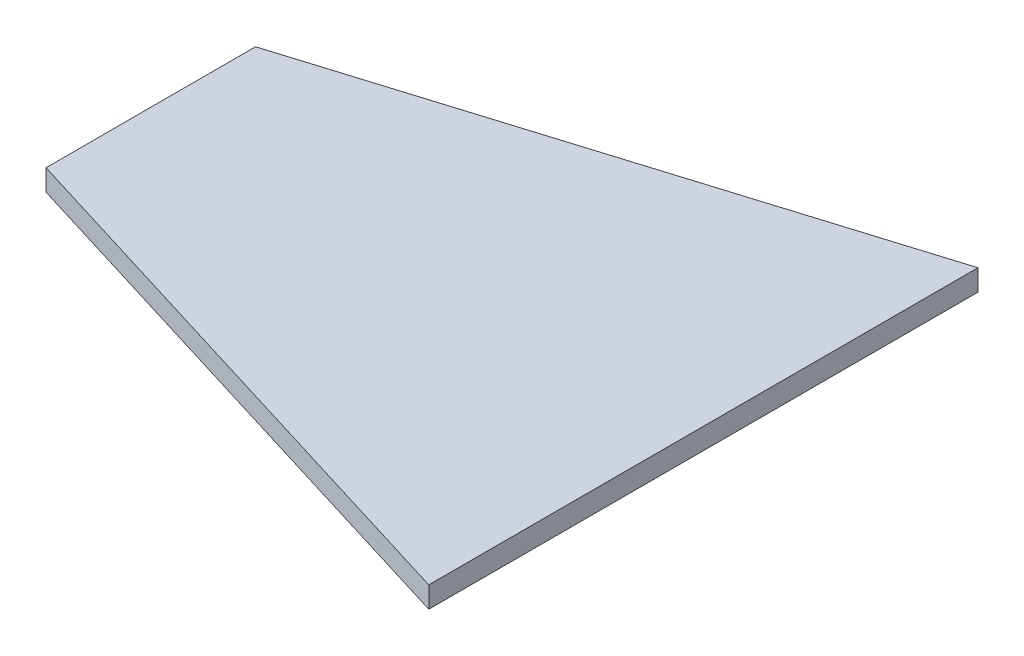
ISO-10303-21;
HEADER;
FILE_DESCRIPTION(('STEP AP214'),'2;1');
FILE_NAME('part.step','',(''),(''),'','','');
FILE_SCHEMA(('AUTOMOTIVE_DESIGN { 1 0 10303 214 1 1 1 1 }'));
ENDSEC;
DATA;
#1=APPLICATION_CONTEXT('core data for automotive mechanical design processes');
#2=APPLICATION_PROTOCOL_DEFINITION('international standard','automotive_design',2000,#1);
#3=PRODUCT_CONTEXT('',#1,'mechanical');
#4=PRODUCT('Part','Part','',(#3));
#5=PRODUCT_RELATED_PRODUCT_CATEGORY('part','',(#4));
#6=PRODUCT_DEFINITION_FORMATION('','',#4);
#7=PRODUCT_DEFINITION_CONTEXT('part definition',#1,'design');
#8=PRODUCT_DEFINITION('design','',#6,#7);
#9=PRODUCT_DEFINITION_SHAPE('','',#8);
#10=(LENGTH_UNIT() NAMED_UNIT(*) SI_UNIT(.MILLI.,.METRE.));
#11=(NAMED_UNIT(*) PLANE_ANGLE_UNIT() SI_UNIT($,.RADIAN.));
#12=(NAMED_UNIT(*) SI_UNIT($,.STERADIAN.) SOLID_ANGLE_UNIT());
#13=UNCERTAINTY_MEASURE_WITH_UNIT(LENGTH_MEASURE(1.E-05),#10,'distance_accuracy_value','');
#14=(GEOMETRIC_REPRESENTATION_CONTEXT(3) GLOBAL_UNCERTAINTY_ASSIGNED_CONTEXT((#13)) GLOBAL_UNIT_ASSIGNED_CONTEXT((#10,
#11,#12)) REPRESENTATION_CONTEXT('',''));
#15=CARTESIAN_POINT('',(0.,0.,0.));
#16=DIRECTION('',(0.,0.,1.));
#17=DIRECTION('',(1.,0.,0.));
#18=AXIS2_PLACEMENT_3D('',#15,#16,#17);
#19=CARTESIAN_POINT('',(-83.058,3.175,-25.527));
#20=DIRECTION('',(0.293777716548138,0.,-0.955873764290956));
#21=DIRECTION('',(-0.955873764290956,0.,-0.293777716548138));
#22=AXIS2_PLACEMENT_3D('',#19,#20,#21);
#23=PLANE('',#22);
#24=DIRECTION('',(0.955873764290956,0.,0.293777716548138));
#25=VECTOR('',#24,1.);
#26=CARTESIAN_POINT('',(-83.058,0.,-25.527));
#27=LINE('',#26,#25);
#28=CARTESIAN_POINT('',(-83.058,0.,-25.527));
#29=VERTEX_POINT('',#28);
#30=CARTESIAN_POINT('',(0.,0.,0.));
#31=VERTEX_POINT('',#30);
#32=EDGE_CURVE('E96',#29,#31,#27,.T.);
#33=ORIENTED_EDGE('',*,*,#32,.T.);
#34=DIRECTION('',(0.,-1.,0.));
#35=VECTOR('',#34,1.);
#36=CARTESIAN_POINT('',(0.,3.175,0.));
#37=LINE('',#36,#35);
#38=CARTESIAN_POINT('',(0.,3.175,0.));
#39=VERTEX_POINT('',#38);
#40=EDGE_CURVE('E11',#39,#31,#37,.T.);
#41=ORIENTED_EDGE('',*,*,#40,.F.);
#42=DIRECTION('',(0.955873764290956,0.,0.293777716548138));
#43=VECTOR('',#42,1.);
#44=CARTESIAN_POINT('',(-83.058,3.175,-25.527));
#45=LINE('',#44,#43);
#46=CARTESIAN_POINT('',(-83.058,3.175,-25.527));
#47=VERTEX_POINT('',#46);
#48=EDGE_CURVE('E84',#47,#39,#45,.T.);
#49=ORIENTED_EDGE('',*,*,#48,.F.);
#50=DIRECTION('',(0.,-1.,0.));
#51=VECTOR('',#50,1.);
#52=CARTESIAN_POINT('',(-83.058,3.175,-25.527));
#53=LINE('',#52,#51);
#54=EDGE_CURVE('E92',#47,#29,#53,.T.);
#55=ORIENTED_EDGE('',*,*,#54,.T.);
#56=EDGE_LOOP('',(#33,#41,#49,#55));
#57=FACE_BOUND('',#56,.T.);
#58=ADVANCED_FACE('F33',(#57),#23,.F.);
#59=CARTESIAN_POINT('',(0.,3.175,0.));
#60=DIRECTION('',(-1.,0.,0.));
#61=DIRECTION('',(0.,0.,1.));
#62=AXIS2_PLACEMENT_3D('',#59,#60,#61);
#63=PLANE('',#62);
#64=DIRECTION('',(0.,0.,-1.));
#65=VECTOR('',#64,1.);
#66=CARTESIAN_POINT('',(0.,0.,0.));
#67=LINE('',#66,#65);
#68=CARTESIAN_POINT('',(0.,0.,-82.55));
#69=VERTEX_POINT('',#68);
#70=EDGE_CURVE('E88',#31,#69,#67,.T.);
#71=ORIENTED_EDGE('',*,*,#70,.T.);
#72=DIRECTION('',(0.,-1.,0.));
#73=VECTOR('',#72,1.);
#74=CARTESIAN_POINT('',(0.,3.175,-82.55));
#75=LINE('',#74,#73);
#76=CARTESIAN_POINT('',(0.,3.175,-82.55));
#77=VERTEX_POINT('',#76);
#78=EDGE_CURVE('E41',#77,#69,#75,.T.);
#79=ORIENTED_EDGE('',*,*,#78,.F.);
#80=DIRECTION('',(0.,0.,-1.));
#81=VECTOR('',#80,1.);
#82=CARTESIAN_POINT('',(0.,3.175,0.));
#83=LINE('',#82,#81);
#84=EDGE_CURVE('E79',#39,#77,#83,.T.);
#85=ORIENTED_EDGE('',*,*,#84,.F.);
#86=ORIENTED_EDGE('',*,*,#40,.T.);
#87=EDGE_LOOP('',(#71,#79,#85,#86));
#88=FACE_BOUND('',#87,.T.);
#89=ADVANCED_FACE('F87',(#88),#63,.F.);
#90=CARTESIAN_POINT('',(0.,3.175,-82.55));
#91=DIRECTION('',(0.293777716548138,0.,0.955873764290956));
#92=DIRECTION('',(0.955873764290956,0.,-0.293777716548138));
#93=AXIS2_PLACEMENT_3D('',#90,#91,#92);
#94=PLANE('',#93);
#95=DIRECTION('',(-0.955873764290956,0.,0.293777716548138));
#96=VECTOR('',#95,1.);
#97=CARTESIAN_POINT('',(0.,0.,-82.55));
#98=LINE('',#97,#96);
#99=CARTESIAN_POINT('',(-83.058,0.,-57.023));
#100=VERTEX_POINT('',#99);
#101=EDGE_CURVE('E66',#69,#100,#98,.T.);
#102=ORIENTED_EDGE('',*,*,#101,.T.);
#103=DIRECTION('',(0.,-1.,0.));
#104=VECTOR('',#103,1.);
#105=CARTESIAN_POINT('',(-83.058,3.175,-57.023));
#106=LINE('',#105,#104);
#107=CARTESIAN_POINT('',(-83.058,3.175,-57.023));
#108=VERTEX_POINT('',#107);
#109=EDGE_CURVE('E89',#108,#100,#106,.T.);
#110=ORIENTED_EDGE('',*,*,#109,.F.);
#111=DIRECTION('',(-0.955873764290956,0.,0.293777716548138));
#112=VECTOR('',#111,1.);
#113=CARTESIAN_POINT('',(0.,3.175,-82.55));
#114=LINE('',#113,#112);
#115=EDGE_CURVE('E82',#77,#108,#114,.T.);
#116=ORIENTED_EDGE('',*,*,#115,.F.);
#117=ORIENTED_EDGE('',*,*,#78,.T.);
#118=EDGE_LOOP('',(#102,#110,#116,#117));
#119=FACE_BOUND('',#118,.T.);
#120=ADVANCED_FACE('F90',(#119),#94,.F.);
#121=CARTESIAN_POINT('',(-83.058,3.175,-57.023));
#122=DIRECTION('',(1.,0.,0.));
#123=DIRECTION('',(0.,0.,-1.));
#124=AXIS2_PLACEMENT_3D('',#121,#122,#123);
#125=PLANE('',#124);
#126=DIRECTION('',(0.,0.,1.));
#127=VECTOR('',#126,1.);
#128=CARTESIAN_POINT('',(-83.058,0.,-57.023));
#129=LINE('',#128,#127);
#130=EDGE_CURVE('E72',#100,#29,#129,.T.);
#131=ORIENTED_EDGE('',*,*,#130,.T.);
#132=ORIENTED_EDGE('',*,*,#54,.F.);
#133=DIRECTION('',(0.,0.,1.));
#134=VECTOR('',#133,1.);
#135=CARTESIAN_POINT('',(-83.058,3.175,-57.023));
#136=LINE('',#135,#134);
#137=EDGE_CURVE('E49',#108,#47,#136,.T.);
#138=ORIENTED_EDGE('',*,*,#137,.F.);
#139=ORIENTED_EDGE('',*,*,#109,.T.);
#140=EDGE_LOOP('',(#131,#132,#138,#139));
#141=FACE_BOUND('',#140,.T.);
#142=ADVANCED_FACE('F103',(#141),#125,.F.);
#143=CARTESIAN_POINT('',(0.,3.175,0.));
#144=DIRECTION('',(0.,1.,0.));
#145=DIRECTION('',(0.,0.,1.));
#146=AXIS2_PLACEMENT_3D('',#143,#144,#145);
#147=PLANE('',#146);
#148=ORIENTED_EDGE('',*,*,#48,.T.);
#149=ORIENTED_EDGE('',*,*,#84,.T.);
#150=ORIENTED_EDGE('',*,*,#115,.T.);
#151=ORIENTED_EDGE('',*,*,#137,.T.);
#152=EDGE_LOOP('',(#148,#149,#150,#151));
#153=FACE_BOUND('',#152,.T.);
#154=ADVANCED_FACE('F80',(#153),#147,.T.);
#155=CARTESIAN_POINT('',(0.,0.,0.));
#156=DIRECTION('',(0.,1.,0.));
#157=DIRECTION('',(0.,0.,1.));
#158=AXIS2_PLACEMENT_3D('',#155,#156,#157);
#159=PLANE('',#158);
#160=ORIENTED_EDGE('',*,*,#32,.F.);
#161=ORIENTED_EDGE('',*,*,#130,.F.);
#162=ORIENTED_EDGE('',*,*,#101,.F.);
#163=ORIENTED_EDGE('',*,*,#70,.F.);
#164=EDGE_LOOP('',(#160,#161,#162,#163));
#165=FACE_BOUND('',#164,.T.);
#166=ADVANCED_FACE('F106',(#165),#159,.F.);
#167=CLOSED_SHELL('',(#58,#89,#120,#142,#154,#166));
#168=MANIFOLD_SOLID_BREP('B2',#167);
#169=ADVANCED_BREP_SHAPE_REPRESENTATION('',(#18,#168),#14);
#170=SHAPE_DEFINITION_REPRESENTATION(#9,#169);
ENDSEC;
END-ISO-10303-21;
